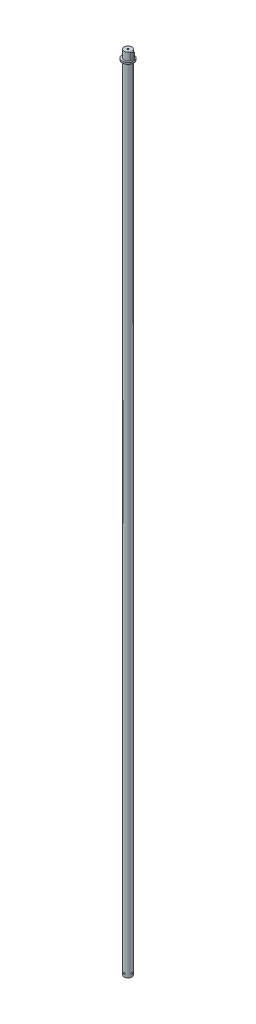
ISO-10303-21;
HEADER;
FILE_DESCRIPTION(('STEP AP214'),'2;1');
FILE_NAME('part.step','',(''),(''),'','','');
FILE_SCHEMA(('AUTOMOTIVE_DESIGN { 1 0 10303 214 1 1 1 1 }'));
ENDSEC;
DATA;
#1=APPLICATION_CONTEXT('core data for automotive mechanical design processes');
#2=APPLICATION_PROTOCOL_DEFINITION('international standard','automotive_design',2000,#1);
#3=PRODUCT_CONTEXT('',#1,'mechanical');
#4=PRODUCT('Part','Part','',(#3));
#5=PRODUCT_RELATED_PRODUCT_CATEGORY('part','',(#4));
#6=PRODUCT_DEFINITION_FORMATION('','',#4);
#7=PRODUCT_DEFINITION_CONTEXT('part definition',#1,'design');
#8=PRODUCT_DEFINITION('design','',#6,#7);
#9=PRODUCT_DEFINITION_SHAPE('','',#8);
#10=(LENGTH_UNIT() NAMED_UNIT(*) SI_UNIT(.MILLI.,.METRE.));
#11=(NAMED_UNIT(*) PLANE_ANGLE_UNIT() SI_UNIT($,.RADIAN.));
#12=(NAMED_UNIT(*) SI_UNIT($,.STERADIAN.) SOLID_ANGLE_UNIT());
#13=UNCERTAINTY_MEASURE_WITH_UNIT(LENGTH_MEASURE(1.E-05),#10,'distance_accuracy_value','');
#14=(GEOMETRIC_REPRESENTATION_CONTEXT(3) GLOBAL_UNCERTAINTY_ASSIGNED_CONTEXT((#13)) GLOBAL_UNIT_ASSIGNED_CONTEXT((#10,
#11,#12)) REPRESENTATION_CONTEXT('',''));
#15=CARTESIAN_POINT('',(0.,0.,0.));
#16=DIRECTION('',(0.,0.,1.));
#17=DIRECTION('',(1.,0.,0.));
#18=AXIS2_PLACEMENT_3D('',#15,#16,#17);
#19=CARTESIAN_POINT('',(0.,1050.,0.));
#20=DIRECTION('',(0.,-1.,0.));
#21=DIRECTION('',(0.,0.,-1.));
#22=AXIS2_PLACEMENT_3D('',#19,#20,#21);
#23=CYLINDRICAL_SURFACE('',#22,5.);
#24=CARTESIAN_POINT('',(-4.89897948556636,4.,-0.999999999999983));
#25=CARTESIAN_POINT('',(-4.89898059043933,4.05556437548198,-0.999997945876028));
#26=CARTESIAN_POINT('',(-4.89993508346913,4.11115462330649,-0.995353171723639));
#27=CARTESIAN_POINT('',(-4.90364431385263,4.22076250511841,-0.976912283588318));
#28=CARTESIAN_POINT('',(-4.90640049166333,4.27477884463107,-0.963108847071164));
#29=CARTESIAN_POINT('',(-4.91338873700356,4.37963730336293,-0.926795782617721));
#30=CARTESIAN_POINT('',(-4.91761933615313,4.43048252153493,-0.904294814152066));
#31=CARTESIAN_POINT('',(-4.92707799486421,4.52767484469462,-0.851249107671027));
#32=CARTESIAN_POINT('',(-4.93230599875015,4.57402220053727,-0.820704818601279));
#33=CARTESIAN_POINT('',(-4.9432529969268,4.6615610038545,-0.751979075653273));
#34=CARTESIAN_POINT('',(-4.94897737836825,4.70267958788414,-0.713705655913262));
#35=CARTESIAN_POINT('',(-4.9602247230302,4.77795753357881,-0.630806789021333));
#36=CARTESIAN_POINT('',(-4.96574767210945,4.81211640741714,-0.586180896977978));
#37=CARTESIAN_POINT('',(-4.97602796417448,4.8727880176285,-0.491361355924228));
#38=CARTESIAN_POINT('',(-4.9807782144152,4.89923151381665,-0.441122567672191));
#39=CARTESIAN_POINT('',(-4.98891736883662,4.94327493704812,-0.336804150387258));
#40=CARTESIAN_POINT('',(-4.99230640044127,4.96087569190099,-0.282724881420537));
#41=CARTESIAN_POINT('',(-4.9973032068841,4.98650719361963,-0.173016773278477));
#42=CARTESIAN_POINT('',(-4.99893386288125,4.99466097757101,-0.117417739214797));
#43=CARTESIAN_POINT('',(-5.00030921183606,5.00155095183831,-0.0056185684375201));
#44=CARTESIAN_POINT('',(-5.00005408652759,5.00028804964582,0.0505815098318596));
#45=CARTESIAN_POINT('',(-4.99770434868515,4.98847381978445,0.161142000743605));
#46=CARTESIAN_POINT('',(-4.99563598365838,4.97805502283215,0.215517214298486));
#47=CARTESIAN_POINT('',(-4.98992177159409,4.94843496754111,0.321731626580318));
#48=CARTESIAN_POINT('',(-4.98627586144039,4.92923335780813,0.373570723747146));
#49=CARTESIAN_POINT('',(-4.97777296019958,4.88246995985273,0.473619463200904));
#50=CARTESIAN_POINT('',(-4.97290848175223,4.85485624889511,0.521804174133916));
#51=CARTESIAN_POINT('',(-4.96250469473785,4.7920909227634,0.612905045859772));
#52=CARTESIAN_POINT('',(-4.95696530855222,4.75693844022948,0.655820599525017));
#53=CARTESIAN_POINT('',(-4.94570964364459,4.67936637789153,0.735951431053474));
#54=CARTESIAN_POINT('',(-4.93999196457516,4.63683081327041,0.773054316573648));
#55=CARTESIAN_POINT('',(-4.9291157159876,4.54608355754925,0.839618493176824));
#56=CARTESIAN_POINT('',(-4.92395715704548,4.4978717591168,0.869079639727767));
#57=CARTESIAN_POINT('',(-4.91478047472923,4.3969791681782,0.919562814801898));
#58=CARTESIAN_POINT('',(-4.91076481563549,4.34428903236034,0.940566647777726));
#59=CARTESIAN_POINT('',(-4.90436476321272,4.23602867627601,0.973390341627599));
#60=CARTESIAN_POINT('',(-4.90198015728427,4.18045883238092,0.985211399456659));
#61=CARTESIAN_POINT('',(-4.89915479267827,4.06903514200096,0.999166006036068));
#62=CARTESIAN_POINT('',(-4.89868147057154,4.01320242568966,1.00146185889793));
#63=CARTESIAN_POINT('',(-4.89964485688853,3.90195177680032,0.996737628310756));
#64=CARTESIAN_POINT('',(-4.90108145700388,3.84653382088114,0.989718073122459));
#65=CARTESIAN_POINT('',(-4.90567232494914,3.73823135970777,0.966702208074174));
#66=CARTESIAN_POINT('',(-4.90880999014496,3.68532765696424,0.950792620839316));
#67=CARTESIAN_POINT('',(-4.91643489351664,3.58293672097126,0.910541035308535));
#68=CARTESIAN_POINT('',(-4.92092224286269,3.53344976956428,0.886198342373194));
#69=CARTESIAN_POINT('',(-4.93081405962039,3.43858689004984,0.829404142215616));
#70=CARTESIAN_POINT('',(-4.93622971864903,3.39327295369917,0.796851077982772));
#71=CARTESIAN_POINT('',(-4.94733723826636,3.30869168799909,0.72469557221273));
#72=CARTESIAN_POINT('',(-4.95302912723818,3.26942498175075,0.685092405144555));
#73=CARTESIAN_POINT('',(-4.96415345869215,3.19743744081442,0.599232273497908));
#74=CARTESIAN_POINT('',(-4.96958057708684,3.16482634535,0.552882498929647));
#75=CARTESIAN_POINT('',(-4.9794712762862,3.10785411850042,0.455267896634773));
#76=CARTESIAN_POINT('',(-4.98393489755211,3.08349264065522,0.404003275433525));
#77=CARTESIAN_POINT('',(-4.99137294061067,3.04387112825337,0.298302680824031));
#78=CARTESIAN_POINT('',(-4.99435579142604,3.02855948177375,0.243886673478096));
#79=CARTESIAN_POINT('',(-4.9985323593766,3.00730875233616,0.133189454679931));
#80=CARTESIAN_POINT('',(-4.99972629199843,3.00136854052432,0.0769084687112327));
#81=CARTESIAN_POINT('',(-5.00018540454121,2.99907301903711,-0.0348728939036047));
#82=CARTESIAN_POINT('',(-4.99948378549351,3.00255271954379,-0.0903698121414834));
#83=CARTESIAN_POINT('',(-4.99630043560318,3.01863395054781,-0.199971031315623));
#84=CARTESIAN_POINT('',(-4.99381872714351,3.03123536634807,-0.254075349753673));
#85=CARTESIAN_POINT('',(-4.98735498365001,3.06512899209164,-0.359252749745077));
#86=CARTESIAN_POINT('',(-4.98337637247913,3.08640137813118,-0.410332443240262));
#87=CARTESIAN_POINT('',(-4.97434722123383,3.1370122413309,-0.508221220185934));
#88=CARTESIAN_POINT('',(-4.96929659645878,3.16635135590372,-0.555029965767393));
#89=CARTESIAN_POINT('',(-4.95857599157869,3.23281938706208,-0.643863890106339));
#90=CARTESIAN_POINT('',(-4.95289733422143,3.27006633638677,-0.685799716116486));
#91=CARTESIAN_POINT('',(-4.94161222903623,3.35105024009577,-0.762882617756828));
#92=CARTESIAN_POINT('',(-4.93600579862875,3.39478872946874,-0.798028083202694));
#93=CARTESIAN_POINT('',(-4.92543342749964,3.48807931670018,-0.860892219455182));
#94=CARTESIAN_POINT('',(-4.92047503631328,3.53768896116036,-0.888526814639749));
#95=CARTESIAN_POINT('',(-4.91185237184445,3.64093277329969,-0.935024049287791));
#96=CARTESIAN_POINT('',(-4.90818692536957,3.69456323869792,-0.953894645979272));
#97=CARTESIAN_POINT('',(-4.90329681128922,3.79026245543657,-0.978669139854256));
#98=CARTESIAN_POINT('',(-4.90168784915661,3.83178541951145,-0.986653898522968));
#99=CARTESIAN_POINT('',(-4.8995287845803,3.91553395455364,-0.997320017960392));
#100=CARTESIAN_POINT('',(-4.89897864563277,3.95775950124817,-1.00000156156204));
#101=CARTESIAN_POINT('',(-4.89897948556636,4.,-0.999999999999983));
#102=B_SPLINE_CURVE_WITH_KNOTS('',3,(#24,#25,#26,#27,#28,#29,#30,#31,#32,#33,#34,#35,#36,#37,
#38,#39,#40,#41,#42,#43,#44,#45,#46,#47,#48,#49,#50,#51,#52,#53,#54,#55,#56,#57,#58,#59,#60,#61,
#62,#63,#64,#65,#66,#67,#68,#69,#70,#71,#72,#73,#74,#75,#76,#77,#78,#79,#80,#81,#82,#83,#84,#85,
#86,#87,#88,#89,#90,#91,#92,#93,#94,#95,#96,#97,#98,#99,#100,#101),.UNSPECIFIED.,.T.,.F.,(4,2,2,
2,2,2,2,2,2,2,2,2,2,2,2,2,2,2,2,2,2,2,2,2,2,2,2,2,2,2,2,2,2,2,2,2,2,2,4),(0.,0.166538463856524,
0.333210239259264,0.499716497915551,0.666213464834831,0.834822525459334,1.00344340032919,
1.17353400434947,1.34360868244056,1.51144248880577,1.67926012113745,1.84468789631034,
2.01012229071247,2.176599242198,2.34309535767563,2.5124934675998,2.68189478120217,
2.85165863170273,3.02140035013521,3.1882375780209,3.35506534525918,3.52029341780815,
3.68553510351895,3.85293059772018,4.02034332867705,4.19032601730947,4.36030156627601,
4.52929813576147,4.69827434689125,4.86431017412183,5.03034391364253,5.19600017072948,
5.36166952132181,5.53001152023093,5.69839338887278,5.86858898576538,6.03862975086429,
6.16523803634392,6.29184195681711),.UNSPECIFIED.);
#103=CARTESIAN_POINT('',(-4.89897948556636,4.,-0.999999999999983));
#104=VERTEX_POINT('',#103);
#105=EDGE_CURVE('E123',#104,#104,#102,.T.);
#106=ORIENTED_EDGE('',*,*,#105,.T.);
#107=EDGE_LOOP('',(#106));
#108=FACE_BOUND('',#107,.T.);
#109=CARTESIAN_POINT('',(4.89897948556635,4.,-1.00000000000002));
#110=CARTESIAN_POINT('',(4.89898059043932,3.94443562451802,-0.999997945876062));
#111=CARTESIAN_POINT('',(4.89993508346913,3.88884537669351,-0.995353171723673));
#112=CARTESIAN_POINT('',(4.90364431385262,3.77923749488159,-0.976912283588352));
#113=CARTESIAN_POINT('',(4.90640049166332,3.72522115536893,-0.963108847071198));
#114=CARTESIAN_POINT('',(4.91338873700356,3.62036269663707,-0.926795782617755));
#115=CARTESIAN_POINT('',(4.91761933615312,3.56951747846507,-0.904294814152099));
#116=CARTESIAN_POINT('',(4.92707799486421,3.47232515530538,-0.85124910767106));
#117=CARTESIAN_POINT('',(4.93230599875014,3.42597779946273,-0.820704818601313));
#118=CARTESIAN_POINT('',(4.9432529969268,3.3384389961455,-0.751979075653307));
#119=CARTESIAN_POINT('',(4.94897737836825,3.29732041211586,-0.713705655913296));
#120=CARTESIAN_POINT('',(4.9602247230302,3.22204246642119,-0.630806789021367));
#121=CARTESIAN_POINT('',(4.96574767210945,3.18788359258285,-0.586180896978012));
#122=CARTESIAN_POINT('',(4.97602796417447,3.12721198237149,-0.491361355924262));
#123=CARTESIAN_POINT('',(4.9807782144152,3.10076848618335,-0.441122567672225));
#124=CARTESIAN_POINT('',(4.98891736883662,3.05672506295188,-0.336804150387292));
#125=CARTESIAN_POINT('',(4.99230640044127,3.03912430809901,-0.282724881420571));
#126=CARTESIAN_POINT('',(4.9973032068841,3.01349280638037,-0.173016773278511));
#127=CARTESIAN_POINT('',(4.99893386288125,3.00533902242899,-0.117417739214831));
#128=CARTESIAN_POINT('',(5.00030921183606,2.99844904816169,-0.00561856843755416));
#129=CARTESIAN_POINT('',(5.00005408652759,2.99971195035418,0.0505815098318253));
#130=CARTESIAN_POINT('',(4.99770434868515,3.01152618021555,0.161142000743571));
#131=CARTESIAN_POINT('',(4.99563598365838,3.02194497716785,0.215517214298452));
#132=CARTESIAN_POINT('',(4.98992177159409,3.05156503245889,0.321731626580283));
#133=CARTESIAN_POINT('',(4.98627586144039,3.07076664219187,0.373570723747111));
#134=CARTESIAN_POINT('',(4.97777296019959,3.11753004014727,0.47361946320087));
#135=CARTESIAN_POINT('',(4.97290848175224,3.14514375110489,0.521804174133882));
#136=CARTESIAN_POINT('',(4.96250469473786,3.2079090772366,0.612905045859738));
#137=CARTESIAN_POINT('',(4.95696530855222,3.24306155977052,0.655820599524983));
#138=CARTESIAN_POINT('',(4.9457096436446,3.32063362210847,0.73595143105344));
#139=CARTESIAN_POINT('',(4.93999196457516,3.36316918672959,0.773054316573614));
#140=CARTESIAN_POINT('',(4.92911571598761,3.45391644245075,0.83961849317679));
#141=CARTESIAN_POINT('',(4.92395715704548,3.5021282408832,0.869079639727733));
#142=CARTESIAN_POINT('',(4.91478047472924,3.6030208318218,0.919562814801864));
#143=CARTESIAN_POINT('',(4.91076481563549,3.65571096763966,0.940566647777692));
#144=CARTESIAN_POINT('',(4.90436476321273,3.76397132372399,0.973390341627565));
#145=CARTESIAN_POINT('',(4.90198015728428,3.81954116761908,0.985211399456625));
#146=CARTESIAN_POINT('',(4.89915479267828,3.93096485799904,0.999166006036034));
#147=CARTESIAN_POINT('',(4.89868147057155,3.98679757431034,1.00146185889789));
#148=CARTESIAN_POINT('',(4.89964485688854,4.09804822319968,0.996737628310721));
#149=CARTESIAN_POINT('',(4.90108145700388,4.15346617911886,0.989718073122425));
#150=CARTESIAN_POINT('',(4.90567232494915,4.26176864029224,0.96670220807414));
#151=CARTESIAN_POINT('',(4.90880999014497,4.31467234303576,0.950792620839281));
#152=CARTESIAN_POINT('',(4.91643489351665,4.41706327902874,0.9105410353085));
#153=CARTESIAN_POINT('',(4.9209222428627,4.46655023043572,0.886198342373159));
#154=CARTESIAN_POINT('',(4.9308140596204,4.56141310995016,0.829404142215581));
#155=CARTESIAN_POINT('',(4.93622971864903,4.60672704630083,0.796851077982737));
#156=CARTESIAN_POINT('',(4.94733723826637,4.69130831200092,0.724695572212695));
#157=CARTESIAN_POINT('',(4.95302912723818,4.73057501824925,0.68509240514452));
#158=CARTESIAN_POINT('',(4.96415345869216,4.80256255918558,0.599232273497873));
#159=CARTESIAN_POINT('',(4.96958057708684,4.83517365465,0.552882498929612));
#160=CARTESIAN_POINT('',(4.9794712762862,4.89214588149958,0.455267896634738));
#161=CARTESIAN_POINT('',(4.98393489755211,4.91650735934478,0.404003275433489));
#162=CARTESIAN_POINT('',(4.99137294061067,4.95612887174663,0.298302680823995));
#163=CARTESIAN_POINT('',(4.99435579142604,4.97144051822625,0.24388667347806));
#164=CARTESIAN_POINT('',(4.9985323593766,4.99269124766385,0.133189454679895));
#165=CARTESIAN_POINT('',(4.99972629199843,4.99863145947568,0.0769084687111967));
#166=CARTESIAN_POINT('',(5.00018540454121,5.00092698096289,-0.0348728939036411));
#167=CARTESIAN_POINT('',(4.99948378549351,4.99744728045621,-0.0903698121415202));
#168=CARTESIAN_POINT('',(4.99630043560318,4.98136604945219,-0.199971031315659));
#169=CARTESIAN_POINT('',(4.99381872714351,4.96876463365193,-0.254075349753709));
#170=CARTESIAN_POINT('',(4.98735498365,4.93487100790836,-0.359252749745114));
#171=CARTESIAN_POINT('',(4.98337637247912,4.91359862186882,-0.410332443240298));
#172=CARTESIAN_POINT('',(4.97434722123382,4.8629877586691,-0.50822122018597));
#173=CARTESIAN_POINT('',(4.96929659645877,4.83364864409628,-0.555029965767428));
#174=CARTESIAN_POINT('',(4.95857599157868,4.76718061293792,-0.643863890106375));
#175=CARTESIAN_POINT('',(4.95289733422142,4.72993366361323,-0.685799716116521));
#176=CARTESIAN_POINT('',(4.94161222903622,4.64894975990422,-0.762882617756863));
#177=CARTESIAN_POINT('',(4.93600579862875,4.60521127053126,-0.798028083202729));
#178=CARTESIAN_POINT('',(4.92543342749964,4.51192068329982,-0.860892219455218));
#179=CARTESIAN_POINT('',(4.92047503631327,4.46231103883963,-0.888526814639784));
#180=CARTESIAN_POINT('',(4.91185237184444,4.35906722670031,-0.935024049287826));
#181=CARTESIAN_POINT('',(4.90818692536956,4.30543676130208,-0.953894645979307));
#182=CARTESIAN_POINT('',(4.90329681128922,4.20973754456343,-0.97866913985429));
#183=CARTESIAN_POINT('',(4.9016878491566,4.16821458048854,-0.986653898523003));
#184=CARTESIAN_POINT('',(4.89952878458029,4.08446604544636,-0.997320017960427));
#185=CARTESIAN_POINT('',(4.89897864563276,4.04224049875183,-1.00000156156207));
#186=CARTESIAN_POINT('',(4.89897948556635,4.,-1.00000000000002));
#187=B_SPLINE_CURVE_WITH_KNOTS('',3,(#109,#110,#111,#112,#113,#114,#115,#116,#117,#118,#119,
#120,#121,#122,#123,#124,#125,#126,#127,#128,#129,#130,#131,#132,#133,#134,#135,#136,#137,#138,
#139,#140,#141,#142,#143,#144,#145,#146,#147,#148,#149,#150,#151,#152,#153,#154,#155,#156,#157,
#158,#159,#160,#161,#162,#163,#164,#165,#166,#167,#168,#169,#170,#171,#172,#173,#174,#175,#176,
#177,#178,#179,#180,#181,#182,#183,#184,#185,#186),.UNSPECIFIED.,.T.,.F.,(4,2,2,2,2,2,2,2,2,2,2,
2,2,2,2,2,2,2,2,2,2,2,2,2,2,2,2,2,2,2,2,2,2,2,2,2,2,2,4),(0.,0.166538463856524,
0.333210239259264,0.499716497915555,0.666213464834831,0.834822525459335,1.00344340032919,
1.17353400434947,1.34360868244057,1.51144248880577,1.67926012113745,1.84468789631034,
2.01012229071247,2.176599242198,2.34309535767563,2.5124934675998,2.68189478120217,
2.85165863170273,3.02140035013522,3.1882375780209,3.35506534525918,3.52029341780816,
3.68553510351895,3.85293059772018,4.02034332867706,4.19032601730948,4.36030156627602,
4.52929813576147,4.69827434689125,4.86431017412183,5.03034391364254,5.19600017072949,
5.36166952132181,5.53001152023093,5.69839338887278,5.86858898576538,6.0386297508643,
6.16523803634393,6.29184195681712),.UNSPECIFIED.);
#188=CARTESIAN_POINT('',(4.89897948556635,4.,-1.00000000000002));
#189=VERTEX_POINT('',#188);
#190=EDGE_CURVE('E119',#189,#189,#187,.T.);
#191=ORIENTED_EDGE('',*,*,#190,.T.);
#192=EDGE_LOOP('',(#191));
#193=FACE_BOUND('',#192,.T.);
#194=CARTESIAN_POINT('',(-1.,4.,4.89897948556636));
#195=CARTESIAN_POINT('',(-0.999997945876045,4.05556437548198,4.89898059043933));
#196=CARTESIAN_POINT('',(-0.995353171723656,4.11115462330649,4.89993508346913));
#197=CARTESIAN_POINT('',(-0.976912283588335,4.22076250511841,4.90364431385263));
#198=CARTESIAN_POINT('',(-0.963108847071181,4.27477884463107,4.90640049166333));
#199=CARTESIAN_POINT('',(-0.926795782617738,4.37963730336293,4.91338873700356));
#200=CARTESIAN_POINT('',(-0.904294814152083,4.43048252153493,4.91761933615313));
#201=CARTESIAN_POINT('',(-0.851249107671044,4.52767484469462,4.92707799486421));
#202=CARTESIAN_POINT('',(-0.820704818601297,4.57402220053727,4.93230599875014));
#203=CARTESIAN_POINT('',(-0.75197907565329,4.6615610038545,4.9432529969268));
#204=CARTESIAN_POINT('',(-0.713705655913279,4.70267958788414,4.94897737836825));
#205=CARTESIAN_POINT('',(-0.63080678902135,4.77795753357881,4.9602247230302));
#206=CARTESIAN_POINT('',(-0.586180896977995,4.81211640741714,4.96574767210945));
#207=CARTESIAN_POINT('',(-0.491361355924245,4.8727880176285,4.97602796417448));
#208=CARTESIAN_POINT('',(-0.441122567672208,4.89923151381665,4.9807782144152));
#209=CARTESIAN_POINT('',(-0.336804150387275,4.94327493704812,4.98891736883662));
#210=CARTESIAN_POINT('',(-0.282724881420554,4.96087569190099,4.99230640044127));
#211=CARTESIAN_POINT('',(-0.173016773278494,4.98650719361963,4.9973032068841));
#212=CARTESIAN_POINT('',(-0.117417739214815,4.99466097757101,4.99893386288125));
#213=CARTESIAN_POINT('',(-0.0056185684375375,5.00155095183831,5.00030921183606));
#214=CARTESIAN_POINT('',(0.0505815098318421,5.00028804964582,5.0000540865276));
#215=CARTESIAN_POINT('',(0.161142000743588,4.98847381978445,4.99770434868515));
#216=CARTESIAN_POINT('',(0.215517214298469,4.97805502283215,4.99563598365838));
#217=CARTESIAN_POINT('',(0.3217316265803,4.94843496754111,4.98992177159409));
#218=CARTESIAN_POINT('',(0.373570723747128,4.92923335780813,4.98627586144039));
#219=CARTESIAN_POINT('',(0.473619463200887,4.88246995985273,4.97777296019958));
#220=CARTESIAN_POINT('',(0.521804174133899,4.85485624889511,4.97290848175223));
#221=CARTESIAN_POINT('',(0.612905045859755,4.7920909227634,4.96250469473785));
#222=CARTESIAN_POINT('',(0.655820599525,4.75693844022948,4.95696530855222));
#223=CARTESIAN_POINT('',(0.735951431053457,4.67936637789153,4.9457096436446));
#224=CARTESIAN_POINT('',(0.773054316573631,4.63683081327041,4.93999196457516));
#225=CARTESIAN_POINT('',(0.839618493176807,4.54608355754925,4.92911571598761));
#226=CARTESIAN_POINT('',(0.86907963972775,4.4978717591168,4.92395715704548));
#227=CARTESIAN_POINT('',(0.919562814801881,4.3969791681782,4.91478047472924));
#228=CARTESIAN_POINT('',(0.940566647777709,4.34428903236034,4.91076481563549));
#229=CARTESIAN_POINT('',(0.973390341627582,4.23602867627601,4.90436476321273));
#230=CARTESIAN_POINT('',(0.985211399456642,4.18045883238092,4.90198015728428));
#231=CARTESIAN_POINT('',(0.999166006036051,4.06903514200095,4.89915479267828));
#232=CARTESIAN_POINT('',(1.00146185889791,4.01320242568966,4.89868147057154));
#233=CARTESIAN_POINT('',(0.996737628310738,3.90195177680032,4.89964485688854));
#234=CARTESIAN_POINT('',(0.989718073122442,3.84653382088114,4.90108145700388));
#235=CARTESIAN_POINT('',(0.966702208074157,3.73823135970777,4.90567232494915));
#236=CARTESIAN_POINT('',(0.950792620839298,3.68532765696424,4.90880999014497));
#237=CARTESIAN_POINT('',(0.910541035308518,3.58293672097126,4.91643489351665));
#238=CARTESIAN_POINT('',(0.886198342373177,3.53344976956428,4.9209222428627));
#239=CARTESIAN_POINT('',(0.829404142215598,3.43858689004984,4.93081405962039));
#240=CARTESIAN_POINT('',(0.796851077982754,3.39327295369917,4.93622971864903));
#241=CARTESIAN_POINT('',(0.724695572212713,3.30869168799909,4.94733723826636));
#242=CARTESIAN_POINT('',(0.685092405144538,3.26942498175075,4.95302912723818));
#243=CARTESIAN_POINT('',(0.599232273497892,3.19743744081442,4.96415345869216));
#244=CARTESIAN_POINT('',(0.552882498929631,3.16482634535,4.96958057708684));
#245=CARTESIAN_POINT('',(0.455267896634756,3.10785411850042,4.9794712762862));
#246=CARTESIAN_POINT('',(0.404003275433508,3.08349264065522,4.98393489755211));
#247=CARTESIAN_POINT('',(0.298302680824013,3.04387112825337,4.99137294061067));
#248=CARTESIAN_POINT('',(0.243886673478078,3.02855948177375,4.99435579142604));
#249=CARTESIAN_POINT('',(0.133189454679913,3.00730875233615,4.9985323593766));
#250=CARTESIAN_POINT('',(0.0769084687112149,3.00136854052432,4.99972629199843));
#251=CARTESIAN_POINT('',(-0.0348728939036226,2.99907301903711,5.00018540454121));
#252=CARTESIAN_POINT('',(-0.0903698121415017,3.00255271954379,4.99948378549351));
#253=CARTESIAN_POINT('',(-0.199971031315641,3.01863395054781,4.99630043560318));
#254=CARTESIAN_POINT('',(-0.25407534975369,3.03123536634807,4.99381872714351));
#255=CARTESIAN_POINT('',(-0.359252749745095,3.06512899209164,4.98735498365001));
#256=CARTESIAN_POINT('',(-0.41033244324028,3.08640137813118,4.98337637247912));
#257=CARTESIAN_POINT('',(-0.508221220185952,3.1370122413309,4.97434722123382));
#258=CARTESIAN_POINT('',(-0.55502996576741,3.16635135590372,4.96929659645878));
#259=CARTESIAN_POINT('',(-0.643863890106357,3.23281938706208,4.95857599157868));
#260=CARTESIAN_POINT('',(-0.685799716116503,3.27006633638677,4.95289733422142));
#261=CARTESIAN_POINT('',(-0.762882617756845,3.35105024009577,4.94161222903622));
#262=CARTESIAN_POINT('',(-0.798028083202711,3.39478872946874,4.93600579862875));
#263=CARTESIAN_POINT('',(-0.860892219455199,3.48807931670018,4.92543342749964));
#264=CARTESIAN_POINT('',(-0.888526814639766,3.53768896116037,4.92047503631328));
#265=CARTESIAN_POINT('',(-0.935024049287808,3.64093277329969,4.91185237184445));
#266=CARTESIAN_POINT('',(-0.95389464597929,3.69456323869792,4.90818692536957));
#267=CARTESIAN_POINT('',(-0.978669139854272,3.79026245543657,4.90329681128922));
#268=CARTESIAN_POINT('',(-0.986653898522985,3.83178541951145,4.90168784915661));
#269=CARTESIAN_POINT('',(-0.997320017960409,3.91553395455364,4.8995287845803));
#270=CARTESIAN_POINT('',(-1.00000156156205,3.95775950124817,4.89897864563277));
#271=CARTESIAN_POINT('',(-1.,4.,4.89897948556636));
#272=B_SPLINE_CURVE_WITH_KNOTS('',3,(#194,#195,#196,#197,#198,#199,#200,#201,#202,#203,#204,
#205,#206,#207,#208,#209,#210,#211,#212,#213,#214,#215,#216,#217,#218,#219,#220,#221,#222,#223,
#224,#225,#226,#227,#228,#229,#230,#231,#232,#233,#234,#235,#236,#237,#238,#239,#240,#241,#242,
#243,#244,#245,#246,#247,#248,#249,#250,#251,#252,#253,#254,#255,#256,#257,#258,#259,#260,#261,
#262,#263,#264,#265,#266,#267,#268,#269,#270,#271),.UNSPECIFIED.,.T.,.F.,(4,2,2,2,2,2,2,2,2,2,2,
2,2,2,2,2,2,2,2,2,2,2,2,2,2,2,2,2,2,2,2,2,2,2,2,2,2,2,4),(0.,0.166538463856523,
0.333210239259264,0.499716497915551,0.666213464834831,0.834822525459334,1.00344340032919,
1.17353400434947,1.34360868244056,1.51144248880577,1.67926012113745,1.84468789631034,
2.01012229071247,2.176599242198,2.34309535767563,2.5124934675998,2.68189478120217,
2.85165863170273,3.02140035013522,3.1882375780209,3.35506534525918,3.52029341780816,
3.68553510351895,3.85293059772018,4.02034332867705,4.19032601730947,4.36030156627601,
4.52929813576147,4.69827434689125,4.86431017412183,5.03034391364253,5.19600017072949,
5.36166952132181,5.53001152023093,5.69839338887278,5.86858898576538,6.0386297508643,
6.16523803634393,6.29184195681712),.UNSPECIFIED.);
#273=CARTESIAN_POINT('',(-1.,4.,4.89897948556636));
#274=VERTEX_POINT('',#273);
#275=EDGE_CURVE('E105',#274,#274,#272,.T.);
#276=ORIENTED_EDGE('',*,*,#275,.T.);
#277=EDGE_LOOP('',(#276));
#278=FACE_BOUND('',#277,.T.);
#279=CARTESIAN_POINT('',(0.,5.,-5.));
#280=CARTESIAN_POINT('',(-0.055576906792633,4.99999795550166,-4.99999897580871));
#281=CARTESIAN_POINT('',(-0.111179660201522,4.99535115703236,-4.99906385178231));
#282=CARTESIAN_POINT('',(-0.220813507689019,4.97690149988475,-4.99542365623231));
#283=CARTESIAN_POINT('',(-0.274843317541356,4.96309136719849,-4.99271717860186));
#284=CARTESIAN_POINT('',(-0.379730305263313,4.92675872637921,-4.98583649278287));
#285=CARTESIAN_POINT('',(-0.430590467933134,4.90424456315531,-4.98166369076718));
#286=CARTESIAN_POINT('',(-0.527807988864225,4.85116775248871,-4.97230398035314));
#287=CARTESIAN_POINT('',(-0.574165615075812,4.8206055843928,-4.96711713235707));
#288=CARTESIAN_POINT('',(-0.661693477314865,4.75186150570857,-4.9562216532997));
#289=CARTESIAN_POINT('',(-0.702793951158524,4.7135916446088,-4.95050745504347));
#290=CARTESIAN_POINT('',(-0.778036756608028,4.6307075836083,-4.93924180452588));
#291=CARTESIAN_POINT('',(-0.812178544770424,4.58609288866488,-4.93369036500424));
#292=CARTESIAN_POINT('',(-0.87283175334762,4.49128380698813,-4.92332441812615));
#293=CARTESIAN_POINT('',(-0.899270938865866,4.44104235620364,-4.91851707364946));
#294=CARTESIAN_POINT('',(-0.943305666580308,4.33671818099592,-4.91026268058418));
#295=CARTESIAN_POINT('',(-0.960902082437238,4.28263583665366,-4.90681549761962));
#296=CARTESIAN_POINT('',(-0.986525299884827,4.17291563609208,-4.90172805252204));
#297=CARTESIAN_POINT('',(-0.994674497958777,4.11730745585777,-4.90006470107188));
#298=CARTESIAN_POINT('',(-1.00155212772612,4.00549017863566,-4.89866375060627));
#299=CARTESIAN_POINT('',(-1.0002815227135,3.94928114367986,-4.89892595467841));
#300=CARTESIAN_POINT('',(-0.988454573101819,3.838753211979,-4.90132551148185));
#301=CARTESIAN_POINT('',(-0.978038540243905,3.78441859437269,-4.90343452858763));
#302=CARTESIAN_POINT('',(-0.948437884623051,3.678283923337,-4.90924546160001));
#303=CARTESIAN_POINT('',(-0.929252843100681,3.62648399108099,-4.91294745357779));
#304=CARTESIAN_POINT('',(-0.88252478367472,3.5264847382964,-4.92155618500408));
#305=CARTESIAN_POINT('',(-0.854926151232115,3.47831212043083,-4.92647089813704));
#306=CARTESIAN_POINT('',(-0.79219357457268,3.38722915002719,-4.93694618773062));
#307=CARTESIAN_POINT('',(-0.757058764356829,3.34431940314884,-4.94250683838366));
#308=CARTESIAN_POINT('',(-0.679499934560585,3.26417059754306,-4.95377021241462));
#309=CARTESIAN_POINT('',(-0.636956161212445,3.22704743214087,-4.95947369210905));
#310=CARTESIAN_POINT('',(-0.54618502406201,3.16044615369878,-4.97028848714408));
#311=CARTESIAN_POINT('',(-0.49795758737939,3.13096813870642,-4.97539979488974));
#312=CARTESIAN_POINT('',(-0.397059386878921,3.08047249077402,-4.98446690160887));
#313=CARTESIAN_POINT('',(-0.344381819585301,3.05946810635546,-4.98842088848272));
#314=CARTESIAN_POINT('',(-0.236148976448665,3.02663952596143,-4.99471408987858));
#315=CARTESIAN_POINT('',(-0.18059405007245,3.01481421792637,-4.99705350000531));
#316=CARTESIAN_POINT('',(-0.0691794056271512,3.00084354620572,-4.99982671866868));
#317=CARTESIAN_POINT('',(-0.013340328325577,2.99853958045973,-5.0002917465247));
#318=CARTESIAN_POINT('',(0.0979249341927132,3.00324985894218,-4.99935051930103));
#319=CARTESIAN_POINT('',(0.153351142443792,3.0102635793526,-4.99794436941446));
#320=CARTESIAN_POINT('',(0.26170565994654,3.03327837354396,-4.99343832008018));
#321=CARTESIAN_POINT('',(0.314651948339902,3.0491980684979,-4.99035376404206));
#322=CARTESIAN_POINT('',(0.417123627499666,3.08948398265581,-4.98283552061033));
#323=CARTESIAN_POINT('',(0.466648761637539,3.11385083467683,-4.97840173214227));
#324=CARTESIAN_POINT('',(0.561541173686217,3.17068249065131,-4.96859911533294));
#325=CARTESIAN_POINT('',(0.606850126752187,3.20324278103894,-4.96321950437052));
#326=CARTESIAN_POINT('',(0.691418019119206,3.27540919120728,-4.95214734829882));
#327=CARTESIAN_POINT('',(0.730676308930762,3.31501606639987,-4.94645476968388));
#328=CARTESIAN_POINT('',(0.802640590774175,3.40087335189112,-4.93529303556965));
#329=CARTESIAN_POINT('',(0.835237702448655,3.44721574422134,-4.92982860233304));
#330=CARTESIAN_POINT('',(0.892185420051206,3.54481136135668,-4.91984191796194));
#331=CARTESIAN_POINT('',(0.916536355922902,3.59606438957355,-4.91531962913342));
#332=CARTESIAN_POINT('',(0.95615184158196,3.70176824614955,-4.90776740584383));
#333=CARTESIAN_POINT('',(0.971463499791051,3.75620084121032,-4.90472974872187));
#334=CARTESIAN_POINT('',(0.992708651627196,3.8669334534909,-4.90047436792025));
#335=CARTESIAN_POINT('',(0.998643368225112,3.92323322620935,-4.89925640691111));
#336=CARTESIAN_POINT('',(1.00092091086747,4.03500886454432,-4.89879149631379));
#337=CARTESIAN_POINT('',(0.997435788070896,4.09048114892701,-4.89950919189301));
#338=CARTESIAN_POINT('',(0.981352304100061,4.20003164990503,-4.90275573484614));
#339=CARTESIAN_POINT('',(0.968754016129298,4.2541098776948,-4.90528456767169));
#340=CARTESIAN_POINT('',(0.934878568498954,4.35922771124054,-4.91185264219159));
#341=CARTESIAN_POINT('',(0.913622506717345,4.41027436050241,-4.91588821018831));
#342=CARTESIAN_POINT('',(0.863054644601605,4.50810372073444,-4.9250171497417));
#343=CARTESIAN_POINT('',(0.833742168774883,4.55488607372514,-4.93011060998894));
#344=CARTESIAN_POINT('',(0.767305914786415,4.64371557215031,-4.94088960523225));
#345=CARTESIAN_POINT('',(0.730057887235181,4.6856687652676,-4.94658372909699));
#346=CARTESIAN_POINT('',(0.649064369013142,4.76278620552917,-4.95786081871955));
#347=CARTESIAN_POINT('',(0.605317387153336,4.79794889031727,-4.96344375863184));
#348=CARTESIAN_POINT('',(0.512017629088248,4.86083464394645,-4.97393832387971));
#349=CARTESIAN_POINT('',(0.462408884429836,4.88847600328002,-4.97884231219246));
#350=CARTESIAN_POINT('',(0.359166360940734,4.93498612259659,-4.98735125085));
#351=CARTESIAN_POINT('',(0.305536260863127,4.95386278953249,-4.99095737138616));
#352=CARTESIAN_POINT('',(0.20982148892378,4.97865194804472,-4.99576372595371));
#353=CARTESIAN_POINT('',(0.168281664013784,4.98664319370776,-4.99734303158452));
#354=CARTESIAN_POINT('',(0.0844995252100666,4.99731791235836,-4.99946154139893));
#355=CARTESIAN_POINT('',(0.0422572337486189,5.00000155450977,-5.00000077873155));
#356=CARTESIAN_POINT('',(0.,5.,-5.));
#357=B_SPLINE_CURVE_WITH_KNOTS('',3,(#279,#280,#281,#282,#283,#284,#285,#286,#287,#288,#289,
#290,#291,#292,#293,#294,#295,#296,#297,#298,#299,#300,#301,#302,#303,#304,#305,#306,#307,#308,
#309,#310,#311,#312,#313,#314,#315,#316,#317,#318,#319,#320,#321,#322,#323,#324,#325,#326,#327,
#328,#329,#330,#331,#332,#333,#334,#335,#336,#337,#338,#339,#340,#341,#342,#343,#344,#345,#346,
#347,#348,#349,#350,#351,#352,#353,#354,#355,#356),.UNSPECIFIED.,.T.,.F.,(4,2,2,2,2,2,2,2,2,2,2,
2,2,2,2,2,2,2,2,2,2,2,2,2,2,2,2,2,2,2,2,2,2,2,2,2,2,2,4),(0.,0.166576130661258,
0.333284650691323,0.499833735250342,0.666372902230863,0.834932670112186,1.00350559674737,
1.17361195005923,1.34370149365197,1.51156185103587,1.67940504281225,1.84471727006278,
2.0100373925373,2.17647490203593,2.3429315474967,2.51238252491351,2.6818356753982,
2.85155274854024,3.02124925698036,3.18810735676265,3.35495607657868,3.52030453950723,
3.68566539216022,3.85305066033359,4.0204538834593,4.19040628579226,4.36035188723466,
4.52940381032723,4.69843368330415,4.86439722567701,5.03035943492608,5.1959196125311,
5.36149367581866,5.52988076239143,5.6983065453293,5.86849496675637,6.03852955517518,
6.16518775289894,6.29184191370996),.UNSPECIFIED.);
#358=CARTESIAN_POINT('',(0.,5.,-5.));
#359=VERTEX_POINT('',#358);
#360=EDGE_CURVE('E46',#359,#359,#357,.T.);
#361=ORIENTED_EDGE('',*,*,#360,.T.);
#362=EDGE_LOOP('',(#361));
#363=FACE_BOUND('',#362,.T.);
#364=CARTESIAN_POINT('',(0.,0.,0.));
#365=DIRECTION('',(0.,1.,0.));
#366=DIRECTION('',(0.,0.,1.));
#367=AXIS2_PLACEMENT_3D('',#364,#365,#366);
#368=CIRCLE('',#367,5.);
#369=CARTESIAN_POINT('',(0.,0.,5.));
#370=VERTEX_POINT('',#369);
#371=EDGE_CURVE('E182',#370,#370,#368,.T.);
#372=ORIENTED_EDGE('',*,*,#371,.T.);
#373=EDGE_LOOP('',(#372));
#374=FACE_BOUND('',#373,.T.);
#375=CARTESIAN_POINT('',(0.,1038.,0.));
#376=DIRECTION('',(0.,1.,0.));
#377=DIRECTION('',(0.,0.,1.));
#378=AXIS2_PLACEMENT_3D('',#375,#376,#377);
#379=CIRCLE('',#378,5.);
#380=CARTESIAN_POINT('',(0.,1038.,5.));
#381=VERTEX_POINT('',#380);
#382=EDGE_CURVE('E11',#381,#381,#379,.T.);
#383=ORIENTED_EDGE('',*,*,#382,.F.);
#384=EDGE_LOOP('',(#383));
#385=FACE_BOUND('',#384,.T.);
#386=ADVANCED_FACE('F41',(#108,#193,#278,#363,#374,#385),#23,.T.);
#387=CARTESIAN_POINT('',(0.,0.,0.));
#388=DIRECTION('',(0.,1.,0.));
#389=DIRECTION('',(0.,0.,1.));
#390=AXIS2_PLACEMENT_3D('',#387,#388,#389);
#391=PLANE('',#390);
#392=ORIENTED_EDGE('',*,*,#371,.F.);
#393=EDGE_LOOP('',(#392));
#394=FACE_BOUND('',#393,.T.);
#395=ADVANCED_FACE('F170',(#394),#391,.F.);
#396=CARTESIAN_POINT('',(0.,1038.,0.));
#397=DIRECTION('',(0.,1.,0.));
#398=DIRECTION('',(0.,0.,1.));
#399=AXIS2_PLACEMENT_3D('',#396,#397,#398);
#400=CYLINDRICAL_SURFACE('',#399,7.5);
#401=CARTESIAN_POINT('',(0.,1038.,0.));
#402=DIRECTION('',(0.,1.,0.));
#403=DIRECTION('',(0.,0.,1.));
#404=AXIS2_PLACEMENT_3D('',#401,#402,#403);
#405=CIRCLE('',#404,7.5);
#406=CARTESIAN_POINT('',(0.,1038.,7.5));
#407=VERTEX_POINT('',#406);
#408=EDGE_CURVE('E191',#407,#407,#405,.T.);
#409=ORIENTED_EDGE('',*,*,#408,.T.);
#410=EDGE_LOOP('',(#409));
#411=FACE_BOUND('',#410,.T.);
#412=CARTESIAN_POINT('',(0.,1040.,0.));
#413=DIRECTION('',(0.,1.,0.));
#414=DIRECTION('',(0.,0.,1.));
#415=AXIS2_PLACEMENT_3D('',#412,#413,#414);
#416=CIRCLE('',#415,7.5);
#417=CARTESIAN_POINT('',(7.43303437365925,1040.,-1.));
#418=VERTEX_POINT('',#417);
#419=CARTESIAN_POINT('',(7.43303437365925,1040.,0.999999999999999));
#420=VERTEX_POINT('',#419);
#421=EDGE_CURVE('E194',#418,#420,#416,.T.);
#422=ORIENTED_EDGE('',*,*,#421,.F.);
#423=DIRECTION('',(0.,-1.,0.));
#424=VECTOR('',#423,1.);
#425=CARTESIAN_POINT('',(7.43303437365925,1053.28105283659,-1.));
#426=LINE('',#425,#424);
#427=CARTESIAN_POINT('',(7.43303437365925,1050.,-1.));
#428=VERTEX_POINT('',#427);
#429=EDGE_CURVE('E204',#428,#418,#426,.T.);
#430=ORIENTED_EDGE('',*,*,#429,.F.);
#431=CARTESIAN_POINT('',(0.,1050.,0.));
#432=DIRECTION('',(0.,1.,0.));
#433=DIRECTION('',(0.,0.,1.));
#434=AXIS2_PLACEMENT_3D('',#431,#432,#433);
#435=CIRCLE('',#434,7.5);
#436=CARTESIAN_POINT('',(7.43303437365925,1050.,0.999999999999999));
#437=VERTEX_POINT('',#436);
#438=EDGE_CURVE('E217',#437,#428,#435,.T.);
#439=ORIENTED_EDGE('',*,*,#438,.F.);
#440=DIRECTION('',(0.,-1.,0.));
#441=VECTOR('',#440,1.);
#442=CARTESIAN_POINT('',(7.43303437365925,1053.28105283659,0.999999999999999));
#443=LINE('',#442,#441);
#444=EDGE_CURVE('E208',#437,#420,#443,.T.);
#445=ORIENTED_EDGE('',*,*,#444,.T.);
#446=EDGE_LOOP('',(#422,#430,#439,#445));
#447=FACE_BOUND('',#446,.T.);
#448=ADVANCED_FACE('F163',(#411,#447),#400,.T.);
#449=CARTESIAN_POINT('',(0.,1038.,0.));
#450=DIRECTION('',(0.,1.,0.));
#451=DIRECTION('',(0.,0.,1.));
#452=AXIS2_PLACEMENT_3D('',#449,#450,#451);
#453=PLANE('',#452);
#454=ORIENTED_EDGE('',*,*,#382,.T.);
#455=EDGE_LOOP('',(#454));
#456=FACE_BOUND('',#455,.T.);
#457=ORIENTED_EDGE('',*,*,#408,.F.);
#458=EDGE_LOOP('',(#457));
#459=FACE_BOUND('',#458,.T.);
#460=ADVANCED_FACE('F159',(#456,#459),#453,.F.);
#461=CARTESIAN_POINT('',(0.,1040.,0.));
#462=DIRECTION('',(0.,1.,0.));
#463=DIRECTION('',(0.,0.,1.));
#464=AXIS2_PLACEMENT_3D('',#461,#462,#463);
#465=PLANE('',#464);
#466=DIRECTION('',(1.,0.,0.));
#467=VECTOR('',#466,1.);
#468=CARTESIAN_POINT('',(0.,1040.,-1.));
#469=LINE('',#468,#467);
#470=CARTESIAN_POINT('',(4.89897948556636,1040.,-1.));
#471=VERTEX_POINT('',#470);
#472=EDGE_CURVE('E70',#471,#418,#469,.T.);
#473=ORIENTED_EDGE('',*,*,#472,.T.);
#474=ORIENTED_EDGE('',*,*,#421,.T.);
#475=DIRECTION('',(1.,0.,0.));
#476=VECTOR('',#475,1.);
#477=CARTESIAN_POINT('',(0.,1040.,0.999999999999999));
#478=LINE('',#477,#476);
#479=CARTESIAN_POINT('',(4.89897948556636,1040.,0.999999999999999));
#480=VERTEX_POINT('',#479);
#481=EDGE_CURVE('E203',#480,#420,#478,.T.);
#482=ORIENTED_EDGE('',*,*,#481,.F.);
#483=CARTESIAN_POINT('',(0.,1040.,0.));
#484=DIRECTION('',(0.,1.,0.));
#485=DIRECTION('',(0.,0.,1.));
#486=AXIS2_PLACEMENT_3D('',#483,#484,#485);
#487=CIRCLE('',#486,5.);
#488=EDGE_CURVE('E185',#471,#480,#487,.T.);
#489=ORIENTED_EDGE('',*,*,#488,.F.);
#490=EDGE_LOOP('',(#473,#474,#482,#489));
#491=FACE_BOUND('',#490,.T.);
#492=ADVANCED_FACE('F162',(#491),#465,.T.);
#493=CARTESIAN_POINT('',(0.,1050.,0.));
#494=DIRECTION('',(0.,1.,0.));
#495=DIRECTION('',(0.,0.,1.));
#496=AXIS2_PLACEMENT_3D('',#493,#494,#495);
#497=PLANE('',#496);
#498=CARTESIAN_POINT('',(0.,1050.,0.));
#499=DIRECTION('',(0.,1.,0.));
#500=DIRECTION('',(0.,0.,1.));
#501=AXIS2_PLACEMENT_3D('',#498,#499,#500);
#502=CIRCLE('',#501,1.);
#503=CARTESIAN_POINT('',(0.,1050.,1.));
#504=VERTEX_POINT('',#503);
#505=EDGE_CURVE('E232',#504,#504,#502,.T.);
#506=ORIENTED_EDGE('',*,*,#505,.F.);
#507=EDGE_LOOP('',(#506));
#508=FACE_BOUND('',#507,.T.);
#509=CARTESIAN_POINT('',(0.,1050.,0.));
#510=DIRECTION('',(0.,1.,0.));
#511=DIRECTION('',(0.,0.,1.));
#512=AXIS2_PLACEMENT_3D('',#509,#510,#511);
#513=CIRCLE('',#512,5.);
#514=CARTESIAN_POINT('',(4.89897948556636,1050.,-1.));
#515=VERTEX_POINT('',#514);
#516=CARTESIAN_POINT('',(4.89897948556636,1050.,0.999999999999999));
#517=VERTEX_POINT('',#516);
#518=EDGE_CURVE('E56',#515,#517,#513,.T.);
#519=ORIENTED_EDGE('',*,*,#518,.T.);
#520=DIRECTION('',(1.,0.,0.));
#521=VECTOR('',#520,1.);
#522=CARTESIAN_POINT('',(0.,1050.,0.999999999999999));
#523=LINE('',#522,#521);
#524=EDGE_CURVE('E220',#517,#437,#523,.T.);
#525=ORIENTED_EDGE('',*,*,#524,.T.);
#526=ORIENTED_EDGE('',*,*,#438,.T.);
#527=DIRECTION('',(1.,0.,0.));
#528=VECTOR('',#527,1.);
#529=CARTESIAN_POINT('',(0.,1050.,-1.));
#530=LINE('',#529,#528);
#531=EDGE_CURVE('E209',#515,#428,#530,.T.);
#532=ORIENTED_EDGE('',*,*,#531,.F.);
#533=EDGE_LOOP('',(#519,#525,#526,#532));
#534=FACE_BOUND('',#533,.T.);
#535=ADVANCED_FACE('F167',(#508,#534),#497,.T.);
#536=ORIENTED_EDGE('',*,*,#518,.F.);
#537=DIRECTION('',(0.,-1.,0.));
#538=VECTOR('',#537,1.);
#539=CARTESIAN_POINT('',(4.89897948556636,1053.28105283659,-1.));
#540=LINE('',#539,#538);
#541=EDGE_CURVE('E197',#515,#471,#540,.T.);
#542=ORIENTED_EDGE('',*,*,#541,.T.);
#543=ORIENTED_EDGE('',*,*,#488,.T.);
#544=DIRECTION('',(0.,-1.,0.));
#545=VECTOR('',#544,1.);
#546=CARTESIAN_POINT('',(4.89897948556636,1053.28105283659,0.999999999999999));
#547=LINE('',#546,#545);
#548=EDGE_CURVE('E213',#517,#480,#547,.T.);
#549=ORIENTED_EDGE('',*,*,#548,.F.);
#550=EDGE_LOOP('',(#536,#542,#543,#549));
#551=FACE_BOUND('',#550,.T.);
#552=ADVANCED_FACE('F43',(#551),#23,.T.);
#553=CARTESIAN_POINT('',(0.,1053.28105283659,-1.));
#554=DIRECTION('',(0.,0.,-1.));
#555=DIRECTION('',(-1.,0.,0.));
#556=AXIS2_PLACEMENT_3D('',#553,#554,#555);
#557=PLANE('',#556);
#558=ORIENTED_EDGE('',*,*,#541,.F.);
#559=ORIENTED_EDGE('',*,*,#531,.T.);
#560=ORIENTED_EDGE('',*,*,#429,.T.);
#561=ORIENTED_EDGE('',*,*,#472,.F.);
#562=EDGE_LOOP('',(#558,#559,#560,#561));
#563=FACE_BOUND('',#562,.T.);
#564=ADVANCED_FACE('F154',(#563),#557,.T.);
#565=CARTESIAN_POINT('',(0.,1053.28105283659,0.999999999999999));
#566=DIRECTION('',(0.,0.,-1.));
#567=DIRECTION('',(-1.,0.,0.));
#568=AXIS2_PLACEMENT_3D('',#565,#566,#567);
#569=PLANE('',#568);
#570=ORIENTED_EDGE('',*,*,#524,.F.);
#571=ORIENTED_EDGE('',*,*,#548,.T.);
#572=ORIENTED_EDGE('',*,*,#481,.T.);
#573=ORIENTED_EDGE('',*,*,#444,.F.);
#574=EDGE_LOOP('',(#570,#571,#572,#573));
#575=FACE_BOUND('',#574,.T.);
#576=ADVANCED_FACE('F150',(#575),#569,.F.);
#577=CARTESIAN_POINT('',(0.,1047.,0.));
#578=DIRECTION('',(0.,1.,0.));
#579=DIRECTION('',(0.,0.,1.));
#580=AXIS2_PLACEMENT_3D('',#577,#578,#579);
#581=CYLINDRICAL_SURFACE('',#580,1.);
#582=CARTESIAN_POINT('',(0.,1047.,0.));
#583=DIRECTION('',(0.,1.,0.));
#584=DIRECTION('',(0.,0.,1.));
#585=AXIS2_PLACEMENT_3D('',#582,#583,#584);
#586=CIRCLE('',#585,1.);
#587=CARTESIAN_POINT('',(0.,1047.,1.));
#588=VERTEX_POINT('',#587);
#589=EDGE_CURVE('E223',#588,#588,#586,.T.);
#590=ORIENTED_EDGE('',*,*,#589,.F.);
#591=EDGE_LOOP('',(#590));
#592=FACE_BOUND('',#591,.T.);
#593=ORIENTED_EDGE('',*,*,#505,.T.);
#594=EDGE_LOOP('',(#593));
#595=FACE_BOUND('',#594,.T.);
#596=ADVANCED_FACE('F146',(#592,#595),#581,.F.);
#597=CARTESIAN_POINT('',(0.,1047.,0.));
#598=DIRECTION('',(0.,1.,0.));
#599=DIRECTION('',(0.,0.,1.));
#600=AXIS2_PLACEMENT_3D('',#597,#598,#599);
#601=PLANE('',#600);
#602=ORIENTED_EDGE('',*,*,#589,.T.);
#603=EDGE_LOOP('',(#602));
#604=FACE_BOUND('',#603,.T.);
#605=ADVANCED_FACE('F143',(#604),#601,.T.);
#606=CARTESIAN_POINT('',(0.,4.,-10.));
#607=DIRECTION('',(0.,0.,1.));
#608=DIRECTION('',(1.,0.,0.));
#609=AXIS2_PLACEMENT_3D('',#606,#607,#608);
#610=CYLINDRICAL_SURFACE('',#609,1.);
#611=CARTESIAN_POINT('',(0.,4.,0.));
#612=DIRECTION('',(-0.707106781186546,0.,0.707106781186549));
#613=DIRECTION('',(0.707106781186549,0.,0.707106781186546));
#614=AXIS2_PLACEMENT_3D('',#611,#612,#613);
#615=ELLIPSE('',#614,1.41421356237309,1.);
#616=CARTESIAN_POINT('',(0.,5.,0.));
#617=VERTEX_POINT('',#616);
#618=CARTESIAN_POINT('',(0.,3.,0.));
#619=VERTEX_POINT('',#618);
#620=EDGE_CURVE('E96',#617,#619,#615,.T.);
#621=ORIENTED_EDGE('',*,*,#620,.T.);
#622=CARTESIAN_POINT('',(0.,4.,0.));
#623=DIRECTION('',(0.707106781186549,0.,0.707106781186546));
#624=DIRECTION('',(-0.707106781186546,0.,0.707106781186549));
#625=AXIS2_PLACEMENT_3D('',#622,#623,#624);
#626=ELLIPSE('',#625,1.4142135623731,1.);
#627=EDGE_CURVE('E104',#619,#617,#626,.T.);
#628=ORIENTED_EDGE('',*,*,#627,.T.);
#629=EDGE_LOOP('',(#621,#628));
#630=FACE_BOUND('',#629,.T.);
#631=ORIENTED_EDGE('',*,*,#360,.F.);
#632=EDGE_LOOP('',(#631));
#633=FACE_BOUND('',#632,.T.);
#634=ADVANCED_FACE('F116',(#630,#633),#610,.F.);
#635=CARTESIAN_POINT('',(-10.,4.,0.));
#636=DIRECTION('',(1.,0.,0.));
#637=DIRECTION('',(0.,0.,-1.));
#638=AXIS2_PLACEMENT_3D('',#635,#636,#637);
#639=CYLINDRICAL_SURFACE('',#638,1.);
#640=CARTESIAN_POINT('',(0.,4.,0.));
#641=DIRECTION('',(0.707106781186549,0.,0.707106781186546));
#642=DIRECTION('',(0.707106781186546,0.,-0.707106781186549));
#643=AXIS2_PLACEMENT_3D('',#640,#641,#642);
#644=ELLIPSE('',#643,1.4142135623731,1.);
#645=EDGE_CURVE('E99',#617,#619,#644,.T.);
#646=ORIENTED_EDGE('',*,*,#645,.T.);
#647=ORIENTED_EDGE('',*,*,#620,.F.);
#648=EDGE_LOOP('',(#646,#647));
#649=FACE_BOUND('',#648,.T.);
#650=ORIENTED_EDGE('',*,*,#105,.F.);
#651=EDGE_LOOP('',(#650));
#652=FACE_BOUND('',#651,.T.);
#653=ADVANCED_FACE('F97',(#649,#652),#639,.F.);
#654=CARTESIAN_POINT('',(0.,4.,0.));
#655=DIRECTION('',(0.707106781186544,0.,-0.707106781186551));
#656=DIRECTION('',(-0.707106781186551,0.,-0.707106781186544));
#657=AXIS2_PLACEMENT_3D('',#654,#655,#656);
#658=ELLIPSE('',#657,1.41421356237309,1.);
#659=EDGE_CURVE('E62',#617,#619,#658,.T.);
#660=ORIENTED_EDGE('',*,*,#659,.F.);
#661=ORIENTED_EDGE('',*,*,#627,.F.);
#662=EDGE_LOOP('',(#660,#661));
#663=FACE_BOUND('',#662,.T.);
#664=ORIENTED_EDGE('',*,*,#190,.F.);
#665=EDGE_LOOP('',(#664));
#666=FACE_BOUND('',#665,.T.);
#667=ADVANCED_FACE('F112',(#663,#666),#639,.F.);
#668=CARTESIAN_POINT('',(0.,4.,10.));
#669=DIRECTION('',(0.,0.,-1.));
#670=DIRECTION('',(-1.,0.,0.));
#671=AXIS2_PLACEMENT_3D('',#668,#669,#670);
#672=CYLINDRICAL_SURFACE('',#671,1.);
#673=ORIENTED_EDGE('',*,*,#659,.T.);
#674=ORIENTED_EDGE('',*,*,#645,.F.);
#675=EDGE_LOOP('',(#673,#674));
#676=FACE_BOUND('',#675,.T.);
#677=ORIENTED_EDGE('',*,*,#275,.F.);
#678=EDGE_LOOP('',(#677));
#679=FACE_BOUND('',#678,.T.);
#680=ADVANCED_FACE('F107',(#676,#679),#672,.F.);
#681=CLOSED_SHELL('',(#386,#395,#448,#460,#492,#535,#552,#564,#576,#596,#605,#634,#653,#667,#680));
#682=MANIFOLD_SOLID_BREP('B2',#681);
#683=ADVANCED_BREP_SHAPE_REPRESENTATION('',(#18,#682),#14);
#684=SHAPE_DEFINITION_REPRESENTATION(#9,#683);
ENDSEC;
END-ISO-10303-21;
